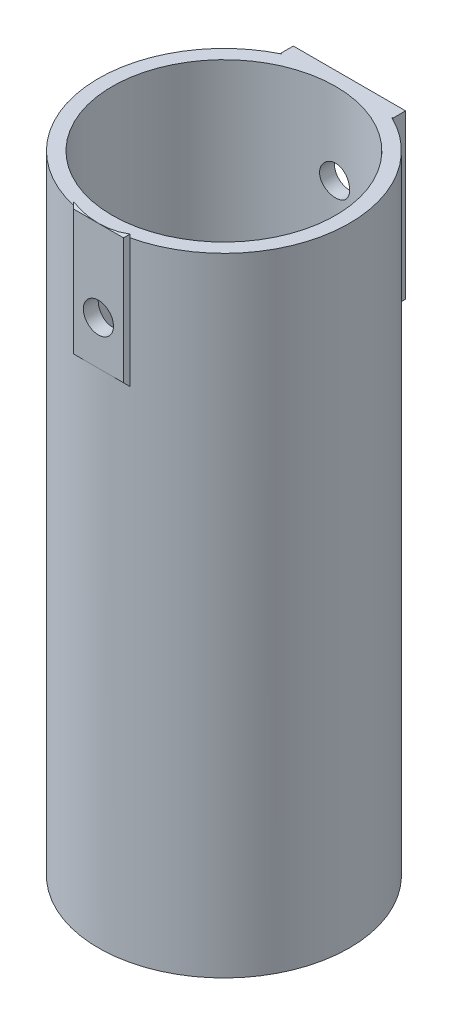
ISO-10303-21;
HEADER;
FILE_DESCRIPTION(('STEP AP214'),'2;1');
FILE_NAME('part.step','',(''),(''),'','','');
FILE_SCHEMA(('AUTOMOTIVE_DESIGN { 1 0 10303 214 1 1 1 1 }'));
ENDSEC;
DATA;
#1=APPLICATION_CONTEXT('core data for automotive mechanical design processes');
#2=APPLICATION_PROTOCOL_DEFINITION('international standard','automotive_design',2000,#1);
#3=PRODUCT_CONTEXT('',#1,'mechanical');
#4=PRODUCT('Part','Part','',(#3));
#5=PRODUCT_RELATED_PRODUCT_CATEGORY('part','',(#4));
#6=PRODUCT_DEFINITION_FORMATION('','',#4);
#7=PRODUCT_DEFINITION_CONTEXT('part definition',#1,'design');
#8=PRODUCT_DEFINITION('design','',#6,#7);
#9=PRODUCT_DEFINITION_SHAPE('','',#8);
#10=(LENGTH_UNIT() NAMED_UNIT(*) SI_UNIT(.MILLI.,.METRE.));
#11=(NAMED_UNIT(*) PLANE_ANGLE_UNIT() SI_UNIT($,.RADIAN.));
#12=(NAMED_UNIT(*) SI_UNIT($,.STERADIAN.) SOLID_ANGLE_UNIT());
#13=UNCERTAINTY_MEASURE_WITH_UNIT(LENGTH_MEASURE(1.E-05),#10,'distance_accuracy_value','');
#14=(GEOMETRIC_REPRESENTATION_CONTEXT(3) GLOBAL_UNCERTAINTY_ASSIGNED_CONTEXT((#13)) GLOBAL_UNIT_ASSIGNED_CONTEXT((#10,
#11,#12)) REPRESENTATION_CONTEXT('',''));
#15=CARTESIAN_POINT('',(0.,0.,0.));
#16=DIRECTION('',(0.,0.,1.));
#17=DIRECTION('',(1.,0.,0.));
#18=AXIS2_PLACEMENT_3D('',#15,#16,#17);
#19=CARTESIAN_POINT('',(0.,50.,0.));
#20=DIRECTION('',(0.,-1.,0.));
#21=DIRECTION('',(0.,0.,-1.));
#22=AXIS2_PLACEMENT_3D('',#19,#20,#21);
#23=CYLINDRICAL_SURFACE('',#22,10.);
#24=CARTESIAN_POINT('',(0.,0.,0.));
#25=DIRECTION('',(0.,1.,0.));
#26=DIRECTION('',(0.,0.,1.));
#27=AXIS2_PLACEMENT_3D('',#24,#25,#26);
#28=CIRCLE('',#27,10.);
#29=CARTESIAN_POINT('',(-1.10901582158742,0.,-9.93831393685412));
#30=VERTEX_POINT('',#29);
#31=CARTESIAN_POINT('',(1.39098417841258,0.,-9.9027856189764));
#32=VERTEX_POINT('',#31);
#33=EDGE_CURVE('E337',#30,#32,#28,.T.);
#34=ORIENTED_EDGE('',*,*,#33,.T.);
#35=DIRECTION('',(0.,-1.,0.));
#36=VECTOR('',#35,1.);
#37=CARTESIAN_POINT('',(1.39098417841258,50.,-9.9027856189764));
#38=LINE('',#37,#36);
#39=CARTESIAN_POINT('',(1.39098417841258,9.99999999999999,-9.9027856189764));
#40=VERTEX_POINT('',#39);
#41=EDGE_CURVE('E674',#32,#40,#38,.F.);
#42=ORIENTED_EDGE('',*,*,#41,.T.);
#43=CARTESIAN_POINT('',(0.,9.99999999999999,0.));
#44=DIRECTION('',(0.,1.,0.));
#45=DIRECTION('',(0.,0.,1.));
#46=AXIS2_PLACEMENT_3D('',#43,#44,#45);
#47=CIRCLE('',#46,10.);
#48=CARTESIAN_POINT('',(0.,9.99999999999999,-10.));
#49=VERTEX_POINT('',#48);
#50=EDGE_CURVE('E728',#40,#49,#47,.T.);
#51=ORIENTED_EDGE('',*,*,#50,.T.);
#52=CARTESIAN_POINT('',(-1.10901582158742,9.99999999999999,-9.93831393685412));
#53=VERTEX_POINT('',#52);
#54=EDGE_CURVE('E724',#49,#53,#47,.T.);
#55=ORIENTED_EDGE('',*,*,#54,.T.);
#56=DIRECTION('',(0.,-1.,0.));
#57=VECTOR('',#56,1.);
#58=CARTESIAN_POINT('',(-1.1090158215874,50.,-9.93831393685412));
#59=LINE('',#58,#57);
#60=EDGE_CURVE('E713',#53,#30,#59,.T.);
#61=ORIENTED_EDGE('',*,*,#60,.T.);
#62=EDGE_LOOP('',(#34,#42,#51,#55,#61));
#63=FACE_BOUND('',#62,.T.);
#64=CARTESIAN_POINT('',(0.,30.,0.));
#65=DIRECTION('',(0.,-0.707106781186547,0.707106781186548));
#66=DIRECTION('',(0.,-0.707106781186548,-0.707106781186547));
#67=AXIS2_PLACEMENT_3D('',#64,#65,#66);
#68=ELLIPSE('',#67,14.142135623731,10.);
#69=CARTESIAN_POINT('',(0.,40.,10.));
#70=VERTEX_POINT('',#69);
#71=CARTESIAN_POINT('',(2.25834261322602,39.7416573867739,9.74165738677395));
#72=VERTEX_POINT('',#71);
#73=EDGE_CURVE('E213',#70,#72,#68,.F.);
#74=ORIENTED_EDGE('',*,*,#73,.F.);
#75=CARTESIAN_POINT('',(0.,30.,0.));
#76=DIRECTION('',(0.,-0.707106781186547,0.707106781186548));
#77=DIRECTION('',(0.,-0.707106781186548,-0.707106781186547));
#78=AXIS2_PLACEMENT_3D('',#75,#76,#77);
#79=ELLIPSE('',#78,14.142135623731,10.);
#80=CARTESIAN_POINT('',(-2.25834261322609,39.7416573867739,9.74165738677393));
#81=VERTEX_POINT('',#80);
#82=EDGE_CURVE('E60',#81,#70,#79,.F.);
#83=ORIENTED_EDGE('',*,*,#82,.F.);
#84=DIRECTION('',(0.,-1.,0.));
#85=VECTOR('',#84,1.);
#86=CARTESIAN_POINT('',(-2.25834261322609,50.,9.74165738677393));
#87=LINE('',#86,#85);
#88=CARTESIAN_POINT('',(-2.25834261322609,50.,9.74165738677393));
#89=VERTEX_POINT('',#88);
#90=EDGE_CURVE('E65',#81,#89,#87,.F.);
#91=ORIENTED_EDGE('',*,*,#90,.T.);
#92=CARTESIAN_POINT('',(0.,50.,0.));
#93=DIRECTION('',(0.,1.,0.));
#94=DIRECTION('',(0.,0.,1.));
#95=AXIS2_PLACEMENT_3D('',#92,#93,#94);
#96=CIRCLE('',#95,10.);
#97=CARTESIAN_POINT('',(-4.35889894354067,50.,-9.));
#98=VERTEX_POINT('',#97);
#99=EDGE_CURVE('E355',#98,#89,#96,.T.);
#100=ORIENTED_EDGE('',*,*,#99,.F.);
#101=DIRECTION('',(0.,-1.,0.));
#102=VECTOR('',#101,1.);
#103=CARTESIAN_POINT('',(-4.35889894354067,50.,-9.));
#104=LINE('',#103,#102);
#105=CARTESIAN_POINT('',(-4.35889894354067,37.,-9.));
#106=VERTEX_POINT('',#105);
#107=EDGE_CURVE('E685',#98,#106,#104,.T.);
#108=ORIENTED_EDGE('',*,*,#107,.T.);
#109=CARTESIAN_POINT('',(0.,37.,0.));
#110=DIRECTION('',(0.,-1.,0.));
#111=DIRECTION('',(0.,0.,-1.));
#112=AXIS2_PLACEMENT_3D('',#109,#110,#111);
#113=CIRCLE('',#112,10.);
#114=CARTESIAN_POINT('',(0.,37.,-10.));
#115=VERTEX_POINT('',#114);
#116=EDGE_CURVE('E48',#106,#115,#113,.T.);
#117=ORIENTED_EDGE('',*,*,#116,.T.);
#118=CARTESIAN_POINT('',(4.35889894354067,37.,-9.));
#119=VERTEX_POINT('',#118);
#120=EDGE_CURVE('E11',#115,#119,#113,.T.);
#121=ORIENTED_EDGE('',*,*,#120,.T.);
#122=DIRECTION('',(0.,-1.,0.));
#123=VECTOR('',#122,1.);
#124=CARTESIAN_POINT('',(4.35889894354067,50.,-9.));
#125=LINE('',#124,#123);
#126=CARTESIAN_POINT('',(4.35889894354067,50.,-9.));
#127=VERTEX_POINT('',#126);
#128=EDGE_CURVE('E693',#119,#127,#125,.F.);
#129=ORIENTED_EDGE('',*,*,#128,.T.);
#130=CARTESIAN_POINT('',(2.25834261322603,50.,9.74165738677395));
#131=VERTEX_POINT('',#130);
#132=EDGE_CURVE('E356',#131,#127,#96,.T.);
#133=ORIENTED_EDGE('',*,*,#132,.F.);
#134=DIRECTION('',(0.,-1.,0.));
#135=VECTOR('',#134,1.);
#136=CARTESIAN_POINT('',(2.25834261322603,50.,9.74165738677395));
#137=LINE('',#136,#135);
#138=EDGE_CURVE('E219',#72,#131,#137,.F.);
#139=ORIENTED_EDGE('',*,*,#138,.F.);
#140=EDGE_LOOP('',(#74,#83,#91,#100,#108,#117,#121,#129,#133,#139));
#141=FACE_BOUND('',#140,.T.);
#142=ADVANCED_FACE('F45',(#63,#141),#23,.T.);
#143=CARTESIAN_POINT('',(0.,50.,0.));
#144=DIRECTION('',(0.,1.,0.));
#145=DIRECTION('',(0.,0.,1.));
#146=AXIS2_PLACEMENT_3D('',#143,#144,#145);
#147=PLANE('',#146);
#148=ORIENTED_EDGE('',*,*,#99,.T.);
#149=CARTESIAN_POINT('',(0.,50.,0.));
#150=DIRECTION('',(0.,1.,0.));
#151=DIRECTION('',(0.,0.,1.));
#152=AXIS2_PLACEMENT_3D('',#149,#150,#151);
#153=CIRCLE('',#152,10.);
#154=CARTESIAN_POINT('',(0.,50.,10.));
#155=VERTEX_POINT('',#154);
#156=EDGE_CURVE('E201',#155,#89,#153,.F.);
#157=ORIENTED_EDGE('',*,*,#156,.F.);
#158=EDGE_CURVE('E352',#155,#131,#96,.T.);
#159=ORIENTED_EDGE('',*,*,#158,.T.);
#160=ORIENTED_EDGE('',*,*,#132,.T.);
#161=DIRECTION('',(1.,0.,0.));
#162=VECTOR('',#161,1.);
#163=CARTESIAN_POINT('',(4.47235041045783,50.,-9.));
#164=LINE('',#163,#162);
#165=CARTESIAN_POINT('',(4.47235041045783,50.,-9.));
#166=VERTEX_POINT('',#165);
#167=EDGE_CURVE('E761',#127,#166,#164,.T.);
#168=ORIENTED_EDGE('',*,*,#167,.T.);
#169=DIRECTION('',(0.,0.,-1.));
#170=VECTOR('',#169,1.);
#171=CARTESIAN_POINT('',(4.47235041045783,50.,-9.));
#172=LINE('',#171,#170);
#173=CARTESIAN_POINT('',(4.47235041045783,50.,-10.));
#174=VERTEX_POINT('',#173);
#175=EDGE_CURVE('E753',#166,#174,#172,.T.);
#176=ORIENTED_EDGE('',*,*,#175,.T.);
#177=DIRECTION('',(1.,0.,0.));
#178=VECTOR('',#177,1.);
#179=CARTESIAN_POINT('',(4.47235041045783,50.,-10.));
#180=LINE('',#179,#178);
#181=CARTESIAN_POINT('',(-4.47235041045784,50.,-10.));
#182=VERTEX_POINT('',#181);
#183=EDGE_CURVE('E769',#182,#174,#180,.T.);
#184=ORIENTED_EDGE('',*,*,#183,.F.);
#185=DIRECTION('',(0.,0.,-1.));
#186=VECTOR('',#185,1.);
#187=CARTESIAN_POINT('',(-4.47235041045784,50.,-9.));
#188=LINE('',#187,#186);
#189=CARTESIAN_POINT('',(-4.47235041045784,50.,-9.));
#190=VERTEX_POINT('',#189);
#191=EDGE_CURVE('E747',#190,#182,#188,.T.);
#192=ORIENTED_EDGE('',*,*,#191,.F.);
#193=EDGE_CURVE('E762',#190,#98,#164,.T.);
#194=ORIENTED_EDGE('',*,*,#193,.T.);
#195=EDGE_LOOP('',(#148,#157,#159,#160,#168,#176,#184,#192,#194));
#196=FACE_BOUND('',#195,.T.);
#197=CARTESIAN_POINT('',(0.,50.,0.));
#198=DIRECTION('',(0.,1.,0.));
#199=DIRECTION('',(0.,0.,1.));
#200=AXIS2_PLACEMENT_3D('',#197,#198,#199);
#201=CIRCLE('',#200,8.9);
#202=CARTESIAN_POINT('',(0.,50.,8.9));
#203=VERTEX_POINT('',#202);
#204=EDGE_CURVE('E716',#203,#203,#201,.T.);
#205=ORIENTED_EDGE('',*,*,#204,.F.);
#206=EDGE_LOOP('',(#205));
#207=FACE_BOUND('',#206,.T.);
#208=ADVANCED_FACE('F327',(#196,#207),#147,.T.);
#209=CARTESIAN_POINT('',(0.,0.,0.));
#210=DIRECTION('',(0.,1.,0.));
#211=DIRECTION('',(0.,0.,1.));
#212=AXIS2_PLACEMENT_3D('',#209,#210,#211);
#213=PLANE('',#212);
#214=DIRECTION('',(0.,0.,-1.));
#215=VECTOR('',#214,1.);
#216=CARTESIAN_POINT('',(-1.10901582158742,0.,-9.));
#217=LINE('',#216,#215);
#218=CARTESIAN_POINT('',(-1.10901582158742,0.,-10.));
#219=VERTEX_POINT('',#218);
#220=EDGE_CURVE('E668',#30,#219,#217,.T.);
#221=ORIENTED_EDGE('',*,*,#220,.T.);
#222=DIRECTION('',(-1.,0.,0.));
#223=VECTOR('',#222,1.);
#224=CARTESIAN_POINT('',(1.39098417841258,0.,-10.));
#225=LINE('',#224,#223);
#226=CARTESIAN_POINT('',(1.39098417841258,0.,-10.));
#227=VERTEX_POINT('',#226);
#228=EDGE_CURVE('E671',#227,#219,#225,.T.);
#229=ORIENTED_EDGE('',*,*,#228,.F.);
#230=DIRECTION('',(0.,0.,-1.));
#231=VECTOR('',#230,1.);
#232=CARTESIAN_POINT('',(1.39098417841258,0.,-9.));
#233=LINE('',#232,#231);
#234=EDGE_CURVE('E675',#32,#227,#233,.T.);
#235=ORIENTED_EDGE('',*,*,#234,.F.);
#236=ORIENTED_EDGE('',*,*,#33,.F.);
#237=EDGE_LOOP('',(#221,#229,#235,#236));
#238=FACE_BOUND('',#237,.T.);
#239=ADVANCED_FACE('F323',(#238),#213,.F.);
#240=CARTESIAN_POINT('',(0.,1.,0.));
#241=DIRECTION('',(0.,1.,0.));
#242=DIRECTION('',(0.,0.,1.));
#243=AXIS2_PLACEMENT_3D('',#240,#241,#242);
#244=CYLINDRICAL_SURFACE('',#243,8.9);
#245=CARTESIAN_POINT('',(0.,42.3,8.9));
#246=CARTESIAN_POINT('',(0.0670781377211432,42.3000028208129,8.89999900596099));
#247=CARTESIAN_POINT('',(0.134197081086319,42.3056433188521,8.8992336750534));
#248=CARTESIAN_POINT('',(0.266564157256824,42.328053563696,8.89625424897466));
#249=CARTESIAN_POINT('',(0.331810315017484,42.3448346397829,8.89403867903188));
#250=CARTESIAN_POINT('',(0.458496620452719,42.3890199650434,8.88840814215475));
#251=CARTESIAN_POINT('',(0.519939412530855,42.4164167348987,8.88499401982287));
#252=CARTESIAN_POINT('',(0.637344542776367,42.481038652833,8.87734517988038));
#253=CARTESIAN_POINT('',(0.693307752115076,42.5182622351071,8.87311059303123));
#254=CARTESIAN_POINT('',(0.798532191616654,42.6017341148688,8.86426276731169));
#255=CARTESIAN_POINT('',(0.847753497872803,42.6480325317827,8.85964751201155));
#256=CARTESIAN_POINT('',(0.937752839528175,42.748232103785,8.85057459624377));
#257=CARTESIAN_POINT('',(0.978530424852567,42.8021336638857,8.84611694418734));
#258=CARTESIAN_POINT('',(1.05063613142942,42.9162723465109,8.83784423950518));
#259=CARTESIAN_POINT('',(1.08192637290333,42.9765336040086,8.83403178902117));
#260=CARTESIAN_POINT('',(1.13392721201414,43.1015158060714,8.82750814655387));
#261=CARTESIAN_POINT('',(1.15463827544417,43.1662365541461,8.82479690608623));
#262=CARTESIAN_POINT('',(1.18477047948174,43.297883938103,8.82080216724464));
#263=CARTESIAN_POINT('',(1.19425941359941,43.3647947923597,8.81951009898818));
#264=CARTESIAN_POINT('',(1.20188787045575,43.499270689756,8.81847386187092));
#265=CARTESIAN_POINT('',(1.20002792187388,43.5668357022757,8.81872962090569));
#266=CARTESIAN_POINT('',(1.18506696689985,43.7002271504733,8.82075229886128));
#267=CARTESIAN_POINT('',(1.17204094335106,43.7660621707835,8.82250913742109));
#268=CARTESIAN_POINT('',(1.1352347347994,43.8946033611088,8.82732029382347));
#269=CARTESIAN_POINT('',(1.11145429952836,43.9573094582723,8.83037464186054));
#270=CARTESIAN_POINT('',(1.05373468660473,44.0780439602813,8.83744799239658));
#271=CARTESIAN_POINT('',(1.01976323205749,44.1360567480913,8.84147005168736));
#272=CARTESIAN_POINT('',(0.942648955681888,44.2455866232117,8.85002333944044));
#273=CARTESIAN_POINT('',(0.899505646276494,44.2971033649594,8.85455459496563));
#274=CARTESIAN_POINT('',(0.804858256322675,44.3926137634113,8.86366043215479));
#275=CARTESIAN_POINT('',(0.753289604165449,44.4365434520073,8.86823506871293));
#276=CARTESIAN_POINT('',(0.643476859478717,44.515133633486,8.87687815853482));
#277=CARTESIAN_POINT('',(0.585232746954249,44.5497940986035,8.88094661028231));
#278=CARTESIAN_POINT('',(0.463670813496186,44.6088631973583,8.88812205742732));
#279=CARTESIAN_POINT('',(0.400350852788373,44.6332674800491,8.89122864462938));
#280=CARTESIAN_POINT('',(0.270460435865293,44.6710788947561,8.89612675790443));
#281=CARTESIAN_POINT('',(0.203890157092766,44.684486626391,8.89791835568046));
#282=CARTESIAN_POINT('',(0.0699415097869438,44.6998406353012,8.89997524160107));
#283=CARTESIAN_POINT('',(0.0025734075371926,44.7018749654118,8.90025225528075));
#284=CARTESIAN_POINT('',(-0.131542827354519,44.6946572978305,8.89928051636145));
#285=CARTESIAN_POINT('',(-0.198290975372178,44.6854055808049,8.89803180170495));
#286=CARTESIAN_POINT('',(-0.329010182929853,44.6559516222352,8.89415618993428));
#287=CARTESIAN_POINT('',(-0.392990950821797,44.6357917062543,8.89153462097184));
#288=CARTESIAN_POINT('',(-0.516663867468622,44.5851378539967,8.88520659086848));
#289=CARTESIAN_POINT('',(-0.576355849174096,44.5546435154555,8.88150008749756));
#290=CARTESIAN_POINT('',(-0.690147762673216,44.4839758113541,8.87338568428076));
#291=CARTESIAN_POINT('',(-0.744212282556202,44.4437458967747,8.8689737396372));
#292=CARTESIAN_POINT('',(-0.844853474252032,44.354828544436,8.85995375254704));
#293=CARTESIAN_POINT('',(-0.891429797915258,44.3061407136606,8.85534570099541));
#294=CARTESIAN_POINT('',(-0.976087863322014,44.2013001574361,8.84641629979933));
#295=CARTESIAN_POINT('',(-1.0141109866649,44.145099891397,8.8420970631639));
#296=CARTESIAN_POINT('',(-1.08017743319848,44.0270588070912,8.83427009808203));
#297=CARTESIAN_POINT('',(-1.10822098339745,43.9652181171691,8.83076235117703));
#298=CARTESIAN_POINT('',(-1.1534388248409,43.8378354015809,8.82497028427619));
#299=CARTESIAN_POINT('',(-1.17064534354033,43.7723049878134,8.82268233994379));
#300=CARTESIAN_POINT('',(-1.19380405559977,43.6392518599805,8.81957882603513));
#301=CARTESIAN_POINT('',(-1.19975686567682,43.5717292552955,8.81876317577545));
#302=CARTESIAN_POINT('',(-1.20022661432629,43.4371920067551,8.81869920696772));
#303=CARTESIAN_POINT('',(-1.19483566641488,43.3701776720483,8.81943826388212));
#304=CARTESIAN_POINT('',(-1.17296685742572,43.238017264055,8.82237318551348));
#305=CARTESIAN_POINT('',(-1.15648900156096,43.1728711898901,8.82456904954546));
#306=CARTESIAN_POINT('',(-1.1129443588247,43.0463137081218,8.83016607241062));
#307=CARTESIAN_POINT('',(-1.08588276216081,42.9849004869782,8.83356664038682));
#308=CARTESIAN_POINT('',(-1.02194787269465,42.8674715180766,8.84119078428593));
#309=CARTESIAN_POINT('',(-0.985074378127462,42.8114558813431,8.84541437713247));
#310=CARTESIAN_POINT('',(-0.90222316639519,42.7059422674935,8.85424968767735));
#311=CARTESIAN_POINT('',(-0.856176928321121,42.6564983207058,8.85886416638966));
#312=CARTESIAN_POINT('',(-0.756431379012642,42.5660049993757,8.86793741891281));
#313=CARTESIAN_POINT('',(-0.70273027656761,42.5249575950835,8.87239615597578));
#314=CARTESIAN_POINT('',(-0.588924050007574,42.4522648091958,8.88067763818166));
#315=CARTESIAN_POINT('',(-0.528791679781304,42.420661769104,8.88449748633299));
#316=CARTESIAN_POINT('',(-0.404053098781527,42.3680488706726,8.89104190504167));
#317=CARTESIAN_POINT('',(-0.339451749377106,42.3470277012005,8.89376764447509));
#318=CARTESIAN_POINT('',(-0.228776701202565,42.3211099933397,8.89717253680145));
#319=CARTESIAN_POINT('',(-0.183395789153596,42.3132053871887,8.89822756687415));
#320=CARTESIAN_POINT('',(-0.0920163159096795,42.3026494468482,8.89964163627656));
#321=CARTESIAN_POINT('',(-0.0460177603417987,42.2999980648316,8.90000068194274));
#322=CARTESIAN_POINT('',(0.,42.3,8.9));
#323=B_SPLINE_CURVE_WITH_KNOTS('',3,(#245,#246,#247,#248,#249,#250,#251,#252,#253,#254,#255,
#256,#257,#258,#259,#260,#261,#262,#263,#264,#265,#266,#267,#268,#269,#270,#271,#272,#273,#274,
#275,#276,#277,#278,#279,#280,#281,#282,#283,#284,#285,#286,#287,#288,#289,#290,#291,#292,#293,
#294,#295,#296,#297,#298,#299,#300,#301,#302,#303,#304,#305,#306,#307,#308,#309,#310,#311,#312,
#313,#314,#315,#316,#317,#318,#319,#320,#321,#322),.UNSPECIFIED.,.T.,.F.,(4,2,2,2,2,2,2,2,2,2,2,
2,2,2,2,2,2,2,2,2,2,2,2,2,2,2,2,2,2,2,2,2,2,2,2,2,2,2,4),(0.,0.20106630106271,0.402337388032662,
0.603466925954886,0.804564435203568,1.00680558025365,1.20905750257033,1.41210662606941,
1.61514680869984,1.81695404491237,2.01875188015309,2.21920511668333,2.41966301824296,
2.62076263410802,2.82187294312998,3.02460384805323,3.22733536023084,3.43015278992697,
3.63295915968139,3.8341932057979,4.03542224764057,4.23587602984944,4.43633761556062,
4.63799277365514,4.83965730461787,5.04266444709588,5.24566697141531,5.44806291497187,
5.65044776666071,5.85119555842163,6.05194325579232,6.25259263080058,6.45324613213951,
6.65545888192047,6.85771902666587,7.06087280177493,7.26380895895582,7.40174816552118,
7.53968611623742),.UNSPECIFIED.);
#324=CARTESIAN_POINT('',(0.,42.3,8.9));
#325=VERTEX_POINT('',#324);
#326=EDGE_CURVE('E187',#325,#325,#323,.T.);
#327=ORIENTED_EDGE('',*,*,#326,.T.);
#328=EDGE_LOOP('',(#327));
#329=FACE_BOUND('',#328,.T.);
#330=CARTESIAN_POINT('',(-1.2,43.5,-8.81873006730561));
#331=CARTESIAN_POINT('',(-1.19999717646564,43.5670750133672,-8.81873109567392));
#332=CARTESIAN_POINT('',(-1.19435718612339,43.6341908412629,-8.81950359313879));
#333=CARTESIAN_POINT('',(-1.17194914098304,43.7665514451997,-8.82250860504999));
#334=CARTESIAN_POINT('',(-1.15516974579552,43.8317942437296,-8.82474260733679));
#335=CARTESIAN_POINT('',(-1.11098933681653,43.9584734429902,-8.8304130990457));
#336=CARTESIAN_POINT('',(-1.08359588197271,44.019912516563,-8.83384873254064));
#337=CARTESIAN_POINT('',(-1.0189817728843,44.1373114051936,-8.84153435262795));
#338=CARTESIAN_POINT('',(-0.981762676427196,44.1932720868863,-8.84578421010148));
#339=CARTESIAN_POINT('',(-0.898295347061486,44.2984993352074,-8.85465029949345));
#340=CARTESIAN_POINT('',(-0.851995990839594,44.3477251880084,-8.85926851365347));
#341=CARTESIAN_POINT('',(-0.751792625180914,44.4377333175723,-8.86833318758825));
#342=CARTESIAN_POINT('',(-0.697888223203176,44.4785151582221,-8.87277963848221));
#343=CARTESIAN_POINT('',(-0.583747005586436,44.5506253506777,-8.88102026885831));
#344=CARTESIAN_POINT('',(-0.52348654390094,44.5819165943385,-8.88481186361642));
#345=CARTESIAN_POINT('',(-0.398506070014864,44.6339195051797,-8.89129371722503));
#346=CARTESIAN_POINT('',(-0.333786249430448,44.6546316266178,-8.89398402336285));
#347=CARTESIAN_POINT('',(-0.202141888763011,44.6847659882773,-8.89794620406023));
#348=CARTESIAN_POINT('',(-0.135233153207056,44.6942561325279,-8.89922660664807));
#349=CARTESIAN_POINT('',(-0.000761417782285507,44.7018877439322,-8.90025387669182));
#350=CARTESIAN_POINT('',(0.0668015522470822,44.7000297262607,-8.90000081376279));
#351=CARTESIAN_POINT('',(0.200201418162895,44.6850718647701,-8.89799653360253));
#352=CARTESIAN_POINT('',(0.26604667051363,44.672045058691,-8.89625505005557));
#353=CARTESIAN_POINT('',(0.394607919473851,44.6352337525371,-8.89148048635775));
#354=CARTESIAN_POINT('',(0.457323848492004,44.6114490202096,-8.88844737832213));
#355=CARTESIAN_POINT('',(0.578070409724727,44.5537204360262,-8.88141358878928));
#356=CARTESIAN_POINT('',(0.636085903712022,44.5197452975565,-8.87740993488574));
#357=CARTESIAN_POINT('',(0.745619636183332,44.4426231186887,-8.86888234838278));
#358=CARTESIAN_POINT('',(0.797137528038928,44.3994755892994,-8.86435838805111));
#359=CARTESIAN_POINT('',(0.892643296411598,44.3048251600587,-8.85525337375759));
#360=CARTESIAN_POINT('',(0.936568052707959,44.2532585615485,-8.85067215182795));
#361=CARTESIAN_POINT('',(1.01514925450731,44.1434516992847,-8.84200428664389));
#362=CARTESIAN_POINT('',(1.04980566171336,44.0852114079567,-8.83791764543312));
#363=CARTESIAN_POINT('',(1.10887182226724,43.9636506044802,-8.83070175522519));
#364=CARTESIAN_POINT('',(1.133275988574,43.9003273446561,-8.82757302850244));
#365=CARTESIAN_POINT('',(1.17108616391002,43.7704297427206,-8.82263702912053));
#366=CARTESIAN_POINT('',(1.18449279315865,43.7038555841721,-8.8208296819412));
#367=CARTESIAN_POINT('',(1.19984263433249,43.5699049832074,-8.81875490946181));
#368=CARTESIAN_POINT('',(1.2018749160346,43.5025389261025,-8.81847551949258));
#369=CARTESIAN_POINT('',(1.19465388151027,43.3684272700033,-8.81945660795463));
#370=CARTESIAN_POINT('',(1.1854008463048,43.3016816556008,-8.82071704804189));
#371=CARTESIAN_POINT('',(1.15594703962999,43.1709758137052,-8.82462483311705));
#372=CARTESIAN_POINT('',(1.13578985986296,43.1070055836038,-8.82726665433678));
#373=CARTESIAN_POINT('',(1.08514499934518,42.9833525356586,-8.83363503149295));
#374=CARTESIAN_POINT('',(1.05465690002667,42.9236698916494,-8.83736163137945));
#375=CARTESIAN_POINT('',(0.983998513936309,42.8098845822885,-8.84550816094048));
#376=CARTESIAN_POINT('',(0.943770096706493,42.7558183135687,-8.84993219542532));
#377=CARTESIAN_POINT('',(0.85485467558265,42.655172898368,-8.85896243215591));
#378=CARTESIAN_POINT('',(0.806167287584821,42.6085940920618,-8.86356864266655));
#379=CARTESIAN_POINT('',(0.701325699909018,42.5239303155714,-8.87248122599417));
#380=CARTESIAN_POINT('',(0.645123870477495,42.4859040610422,-8.87678539438356));
#381=CARTESIAN_POINT('',(0.52707879127136,42.4198321256324,-8.88457550284166));
#382=CARTESIAN_POINT('',(0.465235670851873,42.3917862159742,-8.88806146166541));
#383=CARTESIAN_POINT('',(0.337854209742797,42.3465668866374,-8.89381264382837));
#384=CARTESIAN_POINT('',(0.272327847637239,42.329360217824,-8.89608159709307));
#385=CARTESIAN_POINT('',(0.139283292890514,42.3061998338902,-8.89915867297714));
#386=CARTESIAN_POINT('',(0.07176520571693,42.3002455240074,-8.89996687280698));
#387=CARTESIAN_POINT('',(-0.0627743495483666,42.2997712581167,-8.90003086425981));
#388=CARTESIAN_POINT('',(-0.129795511355434,42.30516102966,-8.89929891191712));
#389=CARTESIAN_POINT('',(-0.26196987516095,42.3270298813447,-8.89638932658922));
#390=CARTESIAN_POINT('',(-0.327123080036352,42.3435089444058,-8.89421169583071));
#391=CARTESIAN_POINT('',(-0.45369536891716,42.3870588467677,-8.88865428654914));
#392=CARTESIAN_POINT('',(-0.515116217551972,42.4141246350161,-8.88527508138131));
#393=CARTESIAN_POINT('',(-0.632558702500168,42.4780702796167,-8.87768757353331));
#394=CARTESIAN_POINT('',(-0.688580232533305,42.5149503290991,-8.87347925453783));
#395=CARTESIAN_POINT('',(-0.794093907957331,42.5978089199065,-8.86466263308718));
#396=CARTESIAN_POINT('',(-0.843533200544255,42.6438544722638,-8.86005153411808));
#397=CARTESIAN_POINT('',(-0.934017450733209,42.7435967123039,-8.85097084419525));
#398=CARTESIAN_POINT('',(-0.975060425673737,42.7972952020431,-8.84650128687452));
#399=CARTESIAN_POINT('',(-1.04774824417395,42.9110991345703,-8.838188282096));
#400=CARTESIAN_POINT('',(-1.07935000156199,42.9712322990913,-8.83434774014843));
#401=CARTESIAN_POINT('',(-1.13196028434388,43.0959725277735,-8.8277616141372));
#402=CARTESIAN_POINT('',(-1.15298013567259,43.1605747240523,-8.82501486004105));
#403=CARTESIAN_POINT('',(-1.17889427209674,43.2712462764937,-8.82158231613313));
#404=CARTESIAN_POINT('',(-1.18679727204425,43.3166225961129,-8.82051817584605));
#405=CARTESIAN_POINT('',(-1.19735107973798,43.4079928787316,-8.81909170200788));
#406=CARTESIAN_POINT('',(-1.20000193693215,43.4539868359121,-8.81872936184947));
#407=CARTESIAN_POINT('',(-1.2,43.5,-8.81873006730561));
#408=B_SPLINE_CURVE_WITH_KNOTS('',3,(#330,#331,#332,#333,#334,#335,#336,#337,#338,#339,#340,
#341,#342,#343,#344,#345,#346,#347,#348,#349,#350,#351,#352,#353,#354,#355,#356,#357,#358,#359,
#360,#361,#362,#363,#364,#365,#366,#367,#368,#369,#370,#371,#372,#373,#374,#375,#376,#377,#378,
#379,#380,#381,#382,#383,#384,#385,#386,#387,#388,#389,#390,#391,#392,#393,#394,#395,#396,#397,
#398,#399,#400,#401,#402,#403,#404,#405,#406,#407),.UNSPECIFIED.,.T.,.F.,(4,2,2,2,2,2,2,2,2,2,2,
2,2,2,2,2,2,2,2,2,2,2,2,2,2,2,2,2,2,2,2,2,2,2,2,2,2,2,4),(0.,0.201056914464861,
0.402318827972903,0.603437672723635,0.804524650602925,1.0067780819974,1.20904195669785,
1.41208677794753,1.61512287990893,1.81692402196955,2.01871600288826,2.21919835333836,
2.419685032203,2.62079365861858,2.82191300906815,3.02463127134265,3.22735037123862,
3.43017980167893,3.63299779252223,3.8342253184706,4.03544783366032,4.23587179939882,
4.43630388649012,4.63796299225574,4.83963125732514,5.04264441803966,5.2456529248204,
5.44803563565828,5.65040764891789,5.85117534361037,6.05194272907167,6.25261444264126,
6.45329010542867,6.65549073134247,6.85773904885672,7.06089672718696,7.26383649876291,
7.40176195612845,7.53968611494508),.UNSPECIFIED.);
#409=CARTESIAN_POINT('',(-1.2,43.5,-8.81873006730561));
#410=VERTEX_POINT('',#409);
#411=EDGE_CURVE('E242',#410,#410,#408,.T.);
#412=ORIENTED_EDGE('',*,*,#411,.T.);
#413=EDGE_LOOP('',(#412));
#414=FACE_BOUND('',#413,.T.);
#415=CARTESIAN_POINT('',(-0.659015821587398,5.,-8.87556748309073));
#416=CARTESIAN_POINT('',(-0.659013875441728,5.04487567195273,-8.8755679266093));
#417=CARTESIAN_POINT('',(-0.655227278975194,5.08978153977167,-8.87585130194617));
#418=CARTESIAN_POINT('',(-0.640177171686674,5.17835095252472,-8.87694924679745));
#419=CARTESIAN_POINT('',(-0.628905280781837,5.22201304780522,-8.87776441165322));
#420=CARTESIAN_POINT('',(-0.599211213838964,5.30680047595594,-8.87981790906258));
#421=CARTESIAN_POINT('',(-0.580792918012924,5.34792717142767,-8.88105601193421));
#422=CARTESIAN_POINT('',(-0.537334613202806,5.42649616514447,-8.88379104131055));
#423=CARTESIAN_POINT('',(-0.512296015293998,5.46393924619779,-8.88528791263691));
#424=CARTESIAN_POINT('',(-0.456249515981346,5.53416647075039,-8.8883419796474));
#425=CARTESIAN_POINT('',(-0.425230585589259,5.56694180871122,-8.88989928247467));
#426=CARTESIAN_POINT('',(-0.358126445346328,5.6268260992998,-8.89285505322161));
#427=CARTESIAN_POINT('',(-0.322041044465955,5.65393483817441,-8.89425351514863));
#428=CARTESIAN_POINT('',(-0.245800109592254,5.70172876162223,-8.8966867753947));
#429=CARTESIAN_POINT('',(-0.20564223183666,5.72241021906732,-8.89772136275149));
#430=CARTESIAN_POINT('',(-0.122414016459743,5.75673479787672,-8.89925532146244));
#431=CARTESIAN_POINT('',(-0.0793437424791998,5.77037807298104,-8.8997547045077));
#432=CARTESIAN_POINT('',(0.00835635820769205,5.79020587561995,-8.90010374470096));
#433=CARTESIAN_POINT('',(0.05298147948746,5.79641118481681,-8.89995521752843));
#434=CARTESIAN_POINT('',(0.142632447196651,5.80125677580465,-8.89896989585153));
#435=CARTESIAN_POINT('',(0.187658287518793,5.79989717269455,-8.89813311181905));
#436=CARTESIAN_POINT('',(0.276747485001246,5.78966773498079,-8.89580763447312));
#437=CARTESIAN_POINT('',(0.320812441626984,5.7808115442384,-8.89432012785597));
#438=CARTESIAN_POINT('',(0.406822484219062,5.75586711744119,-8.89080139028295));
#439=CARTESIAN_POINT('',(0.448767530437975,5.73977874584194,-8.88877014913678));
#440=CARTESIAN_POINT('',(0.52947220414061,5.70077884860599,-8.8843288221479));
#441=CARTESIAN_POINT('',(0.568223022482436,5.67784920985782,-8.88191773872511));
#442=CARTESIAN_POINT('',(0.641332407331047,5.62583105080085,-8.87693852127053));
#443=CARTESIAN_POINT('',(0.675690856734109,5.59674236634233,-8.87437038305424));
#444=CARTESIAN_POINT('',(0.739176367143298,5.53309841241837,-8.86930879492596));
#445=CARTESIAN_POINT('',(0.768283107522313,5.49852284229776,-8.86681566497399));
#446=CARTESIAN_POINT('',(0.820279005057735,5.42495577544226,-8.86215696223539));
#447=CARTESIAN_POINT('',(0.843168189997215,5.38596429844091,-8.85999138798511));
#448=CARTESIAN_POINT('',(0.882054118392958,5.30470062247024,-8.85620481728109));
#449=CARTESIAN_POINT('',(0.898056900348612,5.26243133627165,-8.85458334399594));
#450=CARTESIAN_POINT('',(0.922731393849079,5.17578459264448,-8.85204620515842));
#451=CARTESIAN_POINT('',(0.931403353486501,5.13140720661275,-8.85113051572073));
#452=CARTESIAN_POINT('',(0.941136267403202,5.04203760433134,-8.85010094890716));
#453=CARTESIAN_POINT('',(0.942234425373043,4.99704948271754,-8.84998315220932));
#454=CARTESIAN_POINT('',(0.936886044089093,4.90752971713429,-8.85055091501635));
#455=CARTESIAN_POINT('',(0.930439617673855,4.8629980663478,-8.85123646250622));
#456=CARTESIAN_POINT('',(0.910214141592852,4.77575433800416,-8.85333904057297));
#457=CARTESIAN_POINT('',(0.896451152584167,4.73303849549582,-8.85475446877825));
#458=CARTESIAN_POINT('',(0.862000532475798,4.6505225525792,-8.8581743594481));
#459=CARTESIAN_POINT('',(0.841312744030171,4.61072251844922,-8.86017883529694));
#460=CARTESIAN_POINT('',(0.793513829773645,4.53500898095552,-8.86458751197555));
#461=CARTESIAN_POINT('',(0.76637966200674,4.49911010870334,-8.86699313726175));
#462=CARTESIAN_POINT('',(0.706493193935016,4.43236451771364,-8.87196527498743));
#463=CARTESIAN_POINT('',(0.673740732201486,4.40151794419205,-8.87453179204843));
#464=CARTESIAN_POINT('',(0.603378879612311,4.34561573541014,-8.879593517292));
#465=CARTESIAN_POINT('',(0.565749007386506,4.32058583928995,-8.88208836725893));
#466=CARTESIAN_POINT('',(0.486802129627169,4.27720084638238,-8.88676460935841));
#467=CARTESIAN_POINT('',(0.445485145475539,4.25884571089058,-8.88894600330852));
#468=CARTESIAN_POINT('',(0.360362552878616,4.22935058600399,-8.8928033338721));
#469=CARTESIAN_POINT('',(0.316558806148642,4.21820527447715,-8.89447964283863));
#470=CARTESIAN_POINT('',(0.227682050907458,4.20343699179162,-8.8971982400833));
#471=CARTESIAN_POINT('',(0.18260907454264,4.19981383028918,-8.89824054440409));
#472=CARTESIAN_POINT('',(0.092671972662193,4.20020013410491,-8.89963068724219));
#473=CARTESIAN_POINT('',(0.0478077539592992,4.20417811238202,-8.89998137847862));
#474=CARTESIAN_POINT('',(-0.0406201980153712,4.21959363274262,-8.90001717037295));
#475=CARTESIAN_POINT('',(-0.0841839400081163,4.23103112479101,-8.89970227549527));
#476=CARTESIAN_POINT('',(-0.168712780147078,4.26101683579626,-8.89850109585344));
#477=CARTESIAN_POINT('',(-0.209681448941553,4.27955502559508,-8.89761561579627));
#478=CARTESIAN_POINT('',(-0.287932108575194,4.32321484345634,-8.89542742771666));
#479=CARTESIAN_POINT('',(-0.325214165466892,4.34833635353686,-8.89412472717127));
#480=CARTESIAN_POINT('',(-0.395138280014707,4.40452571383848,-8.89129324301265));
#481=CARTESIAN_POINT('',(-0.427768168056145,4.43560867850985,-8.88976388703495));
#482=CARTESIAN_POINT('',(-0.487364207990464,4.50281238644031,-8.88669618621222));
#483=CARTESIAN_POINT('',(-0.514328984197879,4.53893434980752,-8.88515783927687));
#484=CARTESIAN_POINT('',(-0.561884397284332,4.61528649299668,-8.88227767547079));
#485=CARTESIAN_POINT('',(-0.58245869252116,4.65552686099801,-8.88093636700076));
#486=CARTESIAN_POINT('',(-0.616534678628971,4.73887230702106,-8.87863611957868));
#487=CARTESIAN_POINT('',(-0.630044367082779,4.78197408315459,-8.87767674854431));
#488=CARTESIAN_POINT('',(-0.646206730434401,4.85443667605836,-8.87651142446854));
#489=CARTESIAN_POINT('',(-0.651003735056671,4.88333488792399,-8.87615933835352));
#490=CARTESIAN_POINT('',(-0.657408911781554,4.94148445336473,-8.87568722329967));
#491=CARTESIAN_POINT('',(-0.659017090702302,4.97073580618464,-8.87556719386467));
#492=CARTESIAN_POINT('',(-0.659015821587398,5.,-8.87556748309073));
#493=B_SPLINE_CURVE_WITH_KNOTS('',3,(#415,#416,#417,#418,#419,#420,#421,#422,#423,#424,#425,
#426,#427,#428,#429,#430,#431,#432,#433,#434,#435,#436,#437,#438,#439,#440,#441,#442,#443,#444,
#445,#446,#447,#448,#449,#450,#451,#452,#453,#454,#455,#456,#457,#458,#459,#460,#461,#462,#463,
#464,#465,#466,#467,#468,#469,#470,#471,#472,#473,#474,#475,#476,#477,#478,#479,#480,#481,#482,
#483,#484,#485,#486,#487,#488,#489,#490,#491,#492),.UNSPECIFIED.,.T.,.F.,(4,2,2,2,2,2,2,2,2,2,2,
2,2,2,2,2,2,2,2,2,2,2,2,2,2,2,2,2,2,2,2,2,2,2,2,2,2,2,4),(0.,0.134520257801001,
0.269191370813717,0.403789464891814,0.538358893336995,0.673178911929985,0.808004015231286,
0.942907157249319,1.07780735235777,1.2123297514081,1.3468501037274,1.48112615281879,
1.61540471859625,1.75004200710583,1.88468288439438,2.0198340539638,2.1549846196019,
2.29001643269606,2.42504367580685,2.55940716869812,2.69376865204354,2.82783640771909,
2.96190720990161,3.09646464298113,3.23102594290572,3.36617180419237,3.50131688180659,
3.63636208413982,3.77140386918877,3.9058874682063,4.04037016517707,4.17466361255253,
4.30895465337411,4.44359078249122,4.57825956823272,4.71326994447158,4.84812714770788,
4.93585029796149,5.02357326065112),.UNSPECIFIED.);
#494=CARTESIAN_POINT('',(-0.659015821587398,5.,-8.87556748309073));
#495=VERTEX_POINT('',#494);
#496=EDGE_CURVE('E254',#495,#495,#493,.T.);
#497=ORIENTED_EDGE('',*,*,#496,.T.);
#498=EDGE_LOOP('',(#497));
#499=FACE_BOUND('',#498,.T.);
#500=CARTESIAN_POINT('',(0.,1.,0.));
#501=DIRECTION('',(0.,1.,0.));
#502=DIRECTION('',(0.,0.,1.));
#503=AXIS2_PLACEMENT_3D('',#500,#501,#502);
#504=CIRCLE('',#503,8.9);
#505=CARTESIAN_POINT('',(0.,1.,8.9));
#506=VERTEX_POINT('',#505);
#507=EDGE_CURVE('E717',#506,#506,#504,.T.);
#508=ORIENTED_EDGE('',*,*,#507,.F.);
#509=EDGE_LOOP('',(#508));
#510=FACE_BOUND('',#509,.T.);
#511=ORIENTED_EDGE('',*,*,#204,.T.);
#512=EDGE_LOOP('',(#511));
#513=FACE_BOUND('',#512,.T.);
#514=ADVANCED_FACE('F260',(#329,#414,#499,#510,#513),#244,.F.);
#515=CARTESIAN_POINT('',(0.,1.,0.));
#516=DIRECTION('',(0.,1.,0.));
#517=DIRECTION('',(0.,0.,1.));
#518=AXIS2_PLACEMENT_3D('',#515,#516,#517);
#519=PLANE('',#518);
#520=ORIENTED_EDGE('',*,*,#507,.T.);
#521=EDGE_LOOP('',(#520));
#522=FACE_BOUND('',#521,.T.);
#523=ADVANCED_FACE('F315',(#522),#519,.T.);
#524=CARTESIAN_POINT('',(1.39098417841258,9.99999999999999,-9.));
#525=DIRECTION('',(0.,1.,0.));
#526=DIRECTION('',(0.,0.,1.));
#527=AXIS2_PLACEMENT_3D('',#524,#525,#526);
#528=PLANE('',#527);
#529=ORIENTED_EDGE('',*,*,#50,.F.);
#530=DIRECTION('',(0.,0.,-1.));
#531=VECTOR('',#530,1.);
#532=CARTESIAN_POINT('',(1.39098417841258,9.99999999999999,-9.));
#533=LINE('',#532,#531);
#534=CARTESIAN_POINT('',(1.39098417841258,9.99999999999999,-10.));
#535=VERTEX_POINT('',#534);
#536=EDGE_CURVE('E706',#40,#535,#533,.T.);
#537=ORIENTED_EDGE('',*,*,#536,.T.);
#538=DIRECTION('',(1.,0.,0.));
#539=VECTOR('',#538,1.);
#540=CARTESIAN_POINT('',(1.39098417841258,9.99999999999999,-10.));
#541=LINE('',#540,#539);
#542=EDGE_CURVE('E684',#49,#535,#541,.T.);
#543=ORIENTED_EDGE('',*,*,#542,.F.);
#544=EDGE_LOOP('',(#529,#537,#543));
#545=FACE_BOUND('',#544,.T.);
#546=ADVANCED_FACE('F312',(#545),#528,.T.);
#547=CARTESIAN_POINT('',(-1.10901582158742,9.99999999999999,-9.));
#548=DIRECTION('',(-1.,0.,0.));
#549=DIRECTION('',(0.,-1.,0.));
#550=AXIS2_PLACEMENT_3D('',#547,#548,#549);
#551=PLANE('',#550);
#552=ORIENTED_EDGE('',*,*,#60,.F.);
#553=DIRECTION('',(0.,0.,-1.));
#554=VECTOR('',#553,1.);
#555=CARTESIAN_POINT('',(-1.10901582158742,9.99999999999999,-9.));
#556=LINE('',#555,#554);
#557=CARTESIAN_POINT('',(-1.10901582158742,9.99999999999999,-10.));
#558=VERTEX_POINT('',#557);
#559=EDGE_CURVE('E679',#53,#558,#556,.T.);
#560=ORIENTED_EDGE('',*,*,#559,.T.);
#561=DIRECTION('',(0.,1.,0.));
#562=VECTOR('',#561,1.);
#563=CARTESIAN_POINT('',(-1.10901582158742,9.99999999999999,-10.));
#564=LINE('',#563,#562);
#565=EDGE_CURVE('E678',#219,#558,#564,.T.);
#566=ORIENTED_EDGE('',*,*,#565,.F.);
#567=ORIENTED_EDGE('',*,*,#220,.F.);
#568=EDGE_LOOP('',(#552,#560,#566,#567));
#569=FACE_BOUND('',#568,.T.);
#570=ADVANCED_FACE('F307',(#569),#551,.T.);
#571=CARTESIAN_POINT('',(1.39098417841258,9.99999999999999,-9.));
#572=DIRECTION('',(1.,0.,0.));
#573=DIRECTION('',(0.,1.,0.));
#574=AXIS2_PLACEMENT_3D('',#571,#572,#573);
#575=PLANE('',#574);
#576=ORIENTED_EDGE('',*,*,#41,.F.);
#577=ORIENTED_EDGE('',*,*,#234,.T.);
#578=DIRECTION('',(0.,-1.,0.));
#579=VECTOR('',#578,1.);
#580=CARTESIAN_POINT('',(1.39098417841258,9.99999999999999,-10.));
#581=LINE('',#580,#579);
#582=EDGE_CURVE('E698',#535,#227,#581,.T.);
#583=ORIENTED_EDGE('',*,*,#582,.F.);
#584=ORIENTED_EDGE('',*,*,#536,.F.);
#585=EDGE_LOOP('',(#576,#577,#583,#584));
#586=FACE_BOUND('',#585,.T.);
#587=ADVANCED_FACE('F303',(#586),#575,.T.);
#588=CARTESIAN_POINT('',(0.,0.,-10.));
#589=DIRECTION('',(0.,0.,-1.));
#590=DIRECTION('',(-1.,0.,0.));
#591=AXIS2_PLACEMENT_3D('',#588,#589,#590);
#592=PLANE('',#591);
#593=CARTESIAN_POINT('',(0.140984178412603,5.,-10.));
#594=DIRECTION('',(0.,0.,-1.));
#595=DIRECTION('',(-1.,0.,0.));
#596=AXIS2_PLACEMENT_3D('',#593,#594,#595);
#597=CIRCLE('',#596,0.800000000000001);
#598=CARTESIAN_POINT('',(-0.659015821587398,5.,-10.));
#599=VERTEX_POINT('',#598);
#600=EDGE_CURVE('E228',#599,#599,#597,.T.);
#601=ORIENTED_EDGE('',*,*,#600,.F.);
#602=EDGE_LOOP('',(#601));
#603=FACE_BOUND('',#602,.T.);
#604=ORIENTED_EDGE('',*,*,#228,.T.);
#605=ORIENTED_EDGE('',*,*,#565,.T.);
#606=EDGE_CURVE('E690',#558,#49,#541,.T.);
#607=ORIENTED_EDGE('',*,*,#606,.T.);
#608=ORIENTED_EDGE('',*,*,#542,.T.);
#609=ORIENTED_EDGE('',*,*,#582,.T.);
#610=EDGE_LOOP('',(#604,#605,#607,#608,#609));
#611=FACE_BOUND('',#610,.T.);
#612=ADVANCED_FACE('F299',(#603,#611),#592,.T.);
#613=ORIENTED_EDGE('',*,*,#54,.F.);
#614=ORIENTED_EDGE('',*,*,#606,.F.);
#615=ORIENTED_EDGE('',*,*,#559,.F.);
#616=EDGE_LOOP('',(#613,#614,#615));
#617=FACE_BOUND('',#616,.T.);
#618=ADVANCED_FACE('F302',(#617),#528,.T.);
#619=CARTESIAN_POINT('',(4.47235041045783,37.,-9.));
#620=DIRECTION('',(0.,-1.,0.));
#621=DIRECTION('',(0.,0.,-1.));
#622=AXIS2_PLACEMENT_3D('',#619,#620,#621);
#623=PLANE('',#622);
#624=ORIENTED_EDGE('',*,*,#120,.F.);
#625=DIRECTION('',(-1.,0.,0.));
#626=VECTOR('',#625,1.);
#627=CARTESIAN_POINT('',(4.47235041045783,37.,-10.));
#628=LINE('',#627,#626);
#629=CARTESIAN_POINT('',(4.47235041045783,37.,-10.));
#630=VERTEX_POINT('',#629);
#631=EDGE_CURVE('E778',#630,#115,#628,.T.);
#632=ORIENTED_EDGE('',*,*,#631,.F.);
#633=DIRECTION('',(0.,0.,-1.));
#634=VECTOR('',#633,1.);
#635=CARTESIAN_POINT('',(4.47235041045783,37.,-9.));
#636=LINE('',#635,#634);
#637=CARTESIAN_POINT('',(4.47235041045783,37.,-9.));
#638=VERTEX_POINT('',#637);
#639=EDGE_CURVE('E786',#638,#630,#636,.T.);
#640=ORIENTED_EDGE('',*,*,#639,.F.);
#641=DIRECTION('',(-1.,0.,0.));
#642=VECTOR('',#641,1.);
#643=CARTESIAN_POINT('',(4.47235041045783,37.,-9.));
#644=LINE('',#643,#642);
#645=EDGE_CURVE('E746',#638,#119,#644,.T.);
#646=ORIENTED_EDGE('',*,*,#645,.T.);
#647=EDGE_LOOP('',(#624,#632,#640,#646));
#648=FACE_BOUND('',#647,.T.);
#649=ADVANCED_FACE('F290',(#648),#623,.T.);
#650=CARTESIAN_POINT('',(0.,0.,-9.));
#651=DIRECTION('',(0.,0.,1.));
#652=DIRECTION('',(1.,0.,0.));
#653=AXIS2_PLACEMENT_3D('',#650,#651,#652);
#654=PLANE('',#653);
#655=ORIENTED_EDGE('',*,*,#107,.F.);
#656=ORIENTED_EDGE('',*,*,#193,.F.);
#657=DIRECTION('',(0.,1.,0.));
#658=VECTOR('',#657,1.);
#659=CARTESIAN_POINT('',(-4.47235041045784,37.,-9.));
#660=LINE('',#659,#658);
#661=CARTESIAN_POINT('',(-4.47235041045784,37.,-9.));
#662=VERTEX_POINT('',#661);
#663=EDGE_CURVE('E744',#662,#190,#660,.T.);
#664=ORIENTED_EDGE('',*,*,#663,.F.);
#665=EDGE_CURVE('E737',#106,#662,#644,.T.);
#666=ORIENTED_EDGE('',*,*,#665,.F.);
#667=EDGE_LOOP('',(#655,#656,#664,#666));
#668=FACE_BOUND('',#667,.T.);
#669=ADVANCED_FACE('F295',(#668),#654,.T.);
#670=ORIENTED_EDGE('',*,*,#128,.F.);
#671=ORIENTED_EDGE('',*,*,#645,.F.);
#672=DIRECTION('',(0.,-1.,0.));
#673=VECTOR('',#672,1.);
#674=CARTESIAN_POINT('',(4.47235041045783,37.,-9.));
#675=LINE('',#674,#673);
#676=EDGE_CURVE('E752',#166,#638,#675,.T.);
#677=ORIENTED_EDGE('',*,*,#676,.F.);
#678=ORIENTED_EDGE('',*,*,#167,.F.);
#679=EDGE_LOOP('',(#670,#671,#677,#678));
#680=FACE_BOUND('',#679,.T.);
#681=ADVANCED_FACE('F293',(#680),#654,.T.);
#682=CARTESIAN_POINT('',(0.,0.,-10.));
#683=DIRECTION('',(0.,0.,1.));
#684=DIRECTION('',(1.,0.,0.));
#685=AXIS2_PLACEMENT_3D('',#682,#683,#684);
#686=PLANE('',#685);
#687=CARTESIAN_POINT('',(0.,43.5,-10.));
#688=DIRECTION('',(0.,0.,-1.));
#689=DIRECTION('',(-1.,0.,0.));
#690=AXIS2_PLACEMENT_3D('',#687,#688,#689);
#691=CIRCLE('',#690,1.2);
#692=CARTESIAN_POINT('',(-1.2,43.5,-10.));
#693=VERTEX_POINT('',#692);
#694=EDGE_CURVE('E238',#693,#693,#691,.T.);
#695=ORIENTED_EDGE('',*,*,#694,.F.);
#696=EDGE_LOOP('',(#695));
#697=FACE_BOUND('',#696,.T.);
#698=ORIENTED_EDGE('',*,*,#183,.T.);
#699=DIRECTION('',(0.,-1.,0.));
#700=VECTOR('',#699,1.);
#701=CARTESIAN_POINT('',(4.47235041045783,37.,-10.));
#702=LINE('',#701,#700);
#703=EDGE_CURVE('E773',#174,#630,#702,.T.);
#704=ORIENTED_EDGE('',*,*,#703,.T.);
#705=ORIENTED_EDGE('',*,*,#631,.T.);
#706=CARTESIAN_POINT('',(-4.47235041045784,37.,-10.));
#707=VERTEX_POINT('',#706);
#708=EDGE_CURVE('E739',#115,#707,#628,.T.);
#709=ORIENTED_EDGE('',*,*,#708,.T.);
#710=DIRECTION('',(0.,1.,0.));
#711=VECTOR('',#710,1.);
#712=CARTESIAN_POINT('',(-4.47235041045784,37.,-10.));
#713=LINE('',#712,#711);
#714=EDGE_CURVE('E756',#707,#182,#713,.T.);
#715=ORIENTED_EDGE('',*,*,#714,.T.);
#716=EDGE_LOOP('',(#698,#704,#705,#709,#715));
#717=FACE_BOUND('',#716,.T.);
#718=ADVANCED_FACE('F282',(#697,#717),#686,.F.);
#719=CARTESIAN_POINT('',(-4.47235041045784,37.,-9.));
#720=DIRECTION('',(-1.,0.,0.));
#721=DIRECTION('',(0.,0.,1.));
#722=AXIS2_PLACEMENT_3D('',#719,#720,#721);
#723=PLANE('',#722);
#724=ORIENTED_EDGE('',*,*,#714,.F.);
#725=DIRECTION('',(0.,0.,-1.));
#726=VECTOR('',#725,1.);
#727=CARTESIAN_POINT('',(-4.47235041045784,37.,-9.));
#728=LINE('',#727,#726);
#729=EDGE_CURVE('E783',#662,#707,#728,.T.);
#730=ORIENTED_EDGE('',*,*,#729,.F.);
#731=ORIENTED_EDGE('',*,*,#663,.T.);
#732=ORIENTED_EDGE('',*,*,#191,.T.);
#733=EDGE_LOOP('',(#724,#730,#731,#732));
#734=FACE_BOUND('',#733,.T.);
#735=ADVANCED_FACE('F278',(#734),#723,.T.);
#736=ORIENTED_EDGE('',*,*,#116,.F.);
#737=ORIENTED_EDGE('',*,*,#665,.T.);
#738=ORIENTED_EDGE('',*,*,#729,.T.);
#739=ORIENTED_EDGE('',*,*,#708,.F.);
#740=EDGE_LOOP('',(#736,#737,#738,#739));
#741=FACE_BOUND('',#740,.T.);
#742=ADVANCED_FACE('F281',(#741),#623,.T.);
#743=CARTESIAN_POINT('',(4.47235041045783,37.,-9.));
#744=DIRECTION('',(1.,0.,0.));
#745=DIRECTION('',(0.,0.,-1.));
#746=AXIS2_PLACEMENT_3D('',#743,#744,#745);
#747=PLANE('',#746);
#748=ORIENTED_EDGE('',*,*,#703,.F.);
#749=ORIENTED_EDGE('',*,*,#175,.F.);
#750=ORIENTED_EDGE('',*,*,#676,.T.);
#751=ORIENTED_EDGE('',*,*,#639,.T.);
#752=EDGE_LOOP('',(#748,#749,#750,#751));
#753=FACE_BOUND('',#752,.T.);
#754=ADVANCED_FACE('F269',(#753),#747,.T.);
#755=CARTESIAN_POINT('',(0.,43.5,-8.));
#756=DIRECTION('',(0.,0.,-1.));
#757=DIRECTION('',(-1.,0.,0.));
#758=AXIS2_PLACEMENT_3D('',#755,#756,#757);
#759=CYLINDRICAL_SURFACE('',#758,1.2);
#760=ORIENTED_EDGE('',*,*,#694,.T.);
#761=EDGE_LOOP('',(#760));
#762=FACE_BOUND('',#761,.T.);
#763=ORIENTED_EDGE('',*,*,#411,.F.);
#764=EDGE_LOOP('',(#763));
#765=FACE_BOUND('',#764,.T.);
#766=ADVANCED_FACE('F264',(#762,#765),#759,.F.);
#767=CARTESIAN_POINT('',(0.140984178412603,5.,-8.));
#768=DIRECTION('',(0.,0.,-1.));
#769=DIRECTION('',(-1.,0.,0.));
#770=AXIS2_PLACEMENT_3D('',#767,#768,#769);
#771=CYLINDRICAL_SURFACE('',#770,0.800000000000001);
#772=ORIENTED_EDGE('',*,*,#600,.T.);
#773=EDGE_LOOP('',(#772));
#774=FACE_BOUND('',#773,.T.);
#775=ORIENTED_EDGE('',*,*,#496,.F.);
#776=EDGE_LOOP('',(#775));
#777=FACE_BOUND('',#776,.T.);
#778=ADVANCED_FACE('F268',(#774,#777),#771,.F.);
#779=CARTESIAN_POINT('',(0.,50.,0.));
#780=DIRECTION('',(0.,-1.,0.));
#781=DIRECTION('',(0.,0.,-1.));
#782=AXIS2_PLACEMENT_3D('',#779,#780,#781);
#783=CYLINDRICAL_SURFACE('',#782,10.);
#784=CARTESIAN_POINT('',(2.25834261322603,50.2583426132261,9.74165738677395));
#785=VERTEX_POINT('',#784);
#786=EDGE_CURVE('E223',#131,#785,#137,.F.);
#787=ORIENTED_EDGE('',*,*,#786,.F.);
#788=ORIENTED_EDGE('',*,*,#158,.F.);
#789=CARTESIAN_POINT('',(0.,60.,0.));
#790=DIRECTION('',(0.,0.707106781186547,0.707106781186548));
#791=DIRECTION('',(0.,-0.707106781186548,0.707106781186547));
#792=AXIS2_PLACEMENT_3D('',#789,#790,#791);
#793=ELLIPSE('',#792,14.142135623731,10.);
#794=EDGE_CURVE('E208',#155,#785,#793,.T.);
#795=ORIENTED_EDGE('',*,*,#794,.T.);
#796=EDGE_LOOP('',(#787,#788,#795));
#797=FACE_BOUND('',#796,.T.);
#798=ADVANCED_FACE('F276',(#797),#783,.F.);
#799=CARTESIAN_POINT('',(0.,0.,10.));
#800=DIRECTION('',(0.,0.,-1.));
#801=DIRECTION('',(-1.,0.,0.));
#802=AXIS2_PLACEMENT_3D('',#799,#800,#801);
#803=PLANE('',#802);
#804=CARTESIAN_POINT('',(0.,43.5,10.));
#805=DIRECTION('',(0.,0.,1.));
#806=DIRECTION('',(1.,0.,0.));
#807=AXIS2_PLACEMENT_3D('',#804,#805,#806);
#808=CIRCLE('',#807,1.2);
#809=CARTESIAN_POINT('',(1.2,43.5,10.));
#810=VERTEX_POINT('',#809);
#811=EDGE_CURVE('E194',#810,#810,#808,.T.);
#812=ORIENTED_EDGE('',*,*,#811,.F.);
#813=EDGE_LOOP('',(#812));
#814=FACE_BOUND('',#813,.T.);
#815=DIRECTION('',(1.,0.,0.));
#816=VECTOR('',#815,1.);
#817=CARTESIAN_POINT('',(-2.00000000000003,50.,10.));
#818=LINE('',#817,#816);
#819=CARTESIAN_POINT('',(1.99999999999997,50.,10.));
#820=VERTEX_POINT('',#819);
#821=EDGE_CURVE('E224',#155,#820,#818,.T.);
#822=ORIENTED_EDGE('',*,*,#821,.F.);
#823=DIRECTION('',(1.,0.,0.));
#824=VECTOR('',#823,1.);
#825=CARTESIAN_POINT('',(-2.00000000000003,50.,10.));
#826=LINE('',#825,#824);
#827=CARTESIAN_POINT('',(-2.00000000000003,50.,10.));
#828=VERTEX_POINT('',#827);
#829=EDGE_CURVE('E173',#828,#155,#826,.T.);
#830=ORIENTED_EDGE('',*,*,#829,.F.);
#831=DIRECTION('',(0.,1.,0.));
#832=VECTOR('',#831,1.);
#833=CARTESIAN_POINT('',(-2.00000000000003,40.,10.));
#834=LINE('',#833,#832);
#835=CARTESIAN_POINT('',(-2.00000000000003,40.,10.));
#836=VERTEX_POINT('',#835);
#837=EDGE_CURVE('E168',#836,#828,#834,.T.);
#838=ORIENTED_EDGE('',*,*,#837,.F.);
#839=DIRECTION('',(1.,0.,0.));
#840=VECTOR('',#839,1.);
#841=CARTESIAN_POINT('',(-2.00000000000003,40.,10.));
#842=LINE('',#841,#840);
#843=EDGE_CURVE('E180',#836,#70,#842,.T.);
#844=ORIENTED_EDGE('',*,*,#843,.T.);
#845=DIRECTION('',(1.,0.,0.));
#846=VECTOR('',#845,1.);
#847=CARTESIAN_POINT('',(-2.00000000000003,40.,10.));
#848=LINE('',#847,#846);
#849=CARTESIAN_POINT('',(1.99999999999997,40.,10.));
#850=VERTEX_POINT('',#849);
#851=EDGE_CURVE('E214',#70,#850,#848,.T.);
#852=ORIENTED_EDGE('',*,*,#851,.T.);
#853=DIRECTION('',(0.,1.,0.));
#854=VECTOR('',#853,1.);
#855=CARTESIAN_POINT('',(1.99999999999997,40.,10.));
#856=LINE('',#855,#854);
#857=EDGE_CURVE('E209',#850,#820,#856,.T.);
#858=ORIENTED_EDGE('',*,*,#857,.T.);
#859=EDGE_LOOP('',(#822,#830,#838,#844,#852,#858));
#860=FACE_BOUND('',#859,.T.);
#861=ADVANCED_FACE('F178',(#814,#860),#803,.F.);
#862=CARTESIAN_POINT('',(-2.00000000000003,40.,10.));
#863=DIRECTION('',(0.,-0.707106781186547,0.707106781186548));
#864=DIRECTION('',(0.,-0.707106781186548,-0.707106781186547));
#865=AXIS2_PLACEMENT_3D('',#862,#863,#864);
#866=PLANE('',#865);
#867=ORIENTED_EDGE('',*,*,#851,.F.);
#868=ORIENTED_EDGE('',*,*,#73,.T.);
#869=DIRECTION('',(-0.577350269189626,0.577350269189626,0.577350269189625));
#870=VECTOR('',#869,1.);
#871=CARTESIAN_POINT('',(0.66666666666664,41.3333333333333,11.3333333333333));
#872=LINE('',#871,#870);
#873=EDGE_CURVE('E218',#72,#850,#872,.T.);
#874=ORIENTED_EDGE('',*,*,#873,.T.);
#875=EDGE_LOOP('',(#867,#868,#874));
#876=FACE_BOUND('',#875,.T.);
#877=ADVANCED_FACE('F341',(#876),#866,.T.);
#878=CARTESIAN_POINT('',(1.99999999999997,40.,10.));
#879=DIRECTION('',(0.707106781186547,0.,0.707106781186548));
#880=DIRECTION('',(0.707106781186548,0.,-0.707106781186547));
#881=AXIS2_PLACEMENT_3D('',#878,#879,#880);
#882=PLANE('',#881);
#883=ORIENTED_EDGE('',*,*,#873,.F.);
#884=ORIENTED_EDGE('',*,*,#138,.T.);
#885=ORIENTED_EDGE('',*,*,#786,.T.);
#886=DIRECTION('',(0.577350269189626,0.577350269189626,-0.577350269189625));
#887=VECTOR('',#886,1.);
#888=CARTESIAN_POINT('',(0.66666666666664,48.6666666666667,11.3333333333333));
#889=LINE('',#888,#887);
#890=EDGE_CURVE('E222',#785,#820,#889,.F.);
#891=ORIENTED_EDGE('',*,*,#890,.T.);
#892=ORIENTED_EDGE('',*,*,#857,.F.);
#893=EDGE_LOOP('',(#883,#884,#885,#891,#892));
#894=FACE_BOUND('',#893,.T.);
#895=ADVANCED_FACE('F344',(#894),#882,.T.);
#896=CARTESIAN_POINT('',(-2.00000000000003,50.,10.));
#897=DIRECTION('',(0.,0.707106781186547,0.707106781186548));
#898=DIRECTION('',(0.,-0.707106781186548,0.707106781186547));
#899=AXIS2_PLACEMENT_3D('',#896,#897,#898);
#900=PLANE('',#899);
#901=ORIENTED_EDGE('',*,*,#794,.F.);
#902=ORIENTED_EDGE('',*,*,#821,.T.);
#903=ORIENTED_EDGE('',*,*,#890,.F.);
#904=EDGE_LOOP('',(#901,#902,#903));
#905=FACE_BOUND('',#904,.T.);
#906=ADVANCED_FACE('F271',(#905),#900,.T.);
#907=CARTESIAN_POINT('',(-2.00000000000003,40.,10.));
#908=DIRECTION('',(0.,-0.707106781186547,0.707106781186548));
#909=DIRECTION('',(0.,-0.707106781186548,-0.707106781186547));
#910=AXIS2_PLACEMENT_3D('',#907,#908,#909);
#911=PLANE('',#910);
#912=DIRECTION('',(-0.577350269189626,-0.577350269189626,-0.577350269189625));
#913=VECTOR('',#912,1.);
#914=CARTESIAN_POINT('',(-2.00000000000003,40.,10.));
#915=LINE('',#914,#913);
#916=EDGE_CURVE('E164',#81,#836,#915,.F.);
#917=ORIENTED_EDGE('',*,*,#916,.F.);
#918=ORIENTED_EDGE('',*,*,#82,.T.);
#919=ORIENTED_EDGE('',*,*,#843,.F.);
#920=EDGE_LOOP('',(#917,#918,#919));
#921=FACE_BOUND('',#920,.T.);
#922=ADVANCED_FACE('F185',(#921),#911,.T.);
#923=CARTESIAN_POINT('',(-2.00000000000003,50.,10.));
#924=DIRECTION('',(0.,0.707106781186547,0.707106781186548));
#925=DIRECTION('',(0.,-0.707106781186548,0.707106781186547));
#926=AXIS2_PLACEMENT_3D('',#923,#924,#925);
#927=PLANE('',#926);
#928=CARTESIAN_POINT('',(0.,60.,0.));
#929=DIRECTION('',(0.,0.707106781186547,0.707106781186548));
#930=DIRECTION('',(0.,-0.707106781186548,0.707106781186547));
#931=AXIS2_PLACEMENT_3D('',#928,#929,#930);
#932=ELLIPSE('',#931,14.142135623731,10.);
#933=CARTESIAN_POINT('',(-2.25834261322609,50.2583426132261,9.74165738677393));
#934=VERTEX_POINT('',#933);
#935=EDGE_CURVE('E198',#934,#155,#932,.T.);
#936=ORIENTED_EDGE('',*,*,#935,.F.);
#937=DIRECTION('',(0.577350269189626,-0.577350269189626,0.577350269189625));
#938=VECTOR('',#937,1.);
#939=CARTESIAN_POINT('',(-2.00000000000003,50.,10.));
#940=LINE('',#939,#938);
#941=EDGE_CURVE('E191',#934,#828,#940,.T.);
#942=ORIENTED_EDGE('',*,*,#941,.T.);
#943=ORIENTED_EDGE('',*,*,#829,.T.);
#944=EDGE_LOOP('',(#936,#942,#943));
#945=FACE_BOUND('',#944,.T.);
#946=ADVANCED_FACE('F363',(#945),#927,.T.);
#947=CARTESIAN_POINT('',(-2.00000000000003,40.,10.));
#948=DIRECTION('',(-0.707106781186547,0.,0.707106781186548));
#949=DIRECTION('',(0.707106781186548,0.,0.707106781186547));
#950=AXIS2_PLACEMENT_3D('',#947,#948,#949);
#951=PLANE('',#950);
#952=ORIENTED_EDGE('',*,*,#90,.F.);
#953=ORIENTED_EDGE('',*,*,#916,.T.);
#954=ORIENTED_EDGE('',*,*,#837,.T.);
#955=ORIENTED_EDGE('',*,*,#941,.F.);
#956=EDGE_CURVE('E183',#89,#934,#87,.F.);
#957=ORIENTED_EDGE('',*,*,#956,.F.);
#958=EDGE_LOOP('',(#952,#953,#954,#955,#957));
#959=FACE_BOUND('',#958,.T.);
#960=ADVANCED_FACE('F166',(#959),#951,.T.);
#961=CARTESIAN_POINT('',(0.,50.,0.));
#962=DIRECTION('',(0.,-1.,0.));
#963=DIRECTION('',(0.,0.,-1.));
#964=AXIS2_PLACEMENT_3D('',#961,#962,#963);
#965=CYLINDRICAL_SURFACE('',#964,10.);
#966=ORIENTED_EDGE('',*,*,#935,.T.);
#967=ORIENTED_EDGE('',*,*,#156,.T.);
#968=ORIENTED_EDGE('',*,*,#956,.T.);
#969=EDGE_LOOP('',(#966,#967,#968));
#970=FACE_BOUND('',#969,.T.);
#971=ADVANCED_FACE('F365',(#970),#965,.F.);
#972=CARTESIAN_POINT('',(0.,43.5,-20.));
#973=DIRECTION('',(0.,0.,1.));
#974=DIRECTION('',(1.,0.,0.));
#975=AXIS2_PLACEMENT_3D('',#972,#973,#974);
#976=CYLINDRICAL_SURFACE('',#975,1.2);
#977=ORIENTED_EDGE('',*,*,#811,.T.);
#978=EDGE_LOOP('',(#977));
#979=FACE_BOUND('',#978,.T.);
#980=ORIENTED_EDGE('',*,*,#326,.F.);
#981=EDGE_LOOP('',(#980));
#982=FACE_BOUND('',#981,.T.);
#983=ADVANCED_FACE('F374',(#979,#982),#976,.F.);
#984=CLOSED_SHELL('',(#142,#208,#239,#514,#523,#546,#570,#587,#612,#618,#649,#669,#681,#718,
#735,#742,#754,#766,#778,#798,#861,#877,#895,#906,#922,#946,#960,#971,#983));
#985=MANIFOLD_SOLID_BREP('B2',#984);
#986=ADVANCED_BREP_SHAPE_REPRESENTATION('',(#18,#985),#14);
#987=SHAPE_DEFINITION_REPRESENTATION(#9,#986);
ENDSEC;
END-ISO-10303-21;
